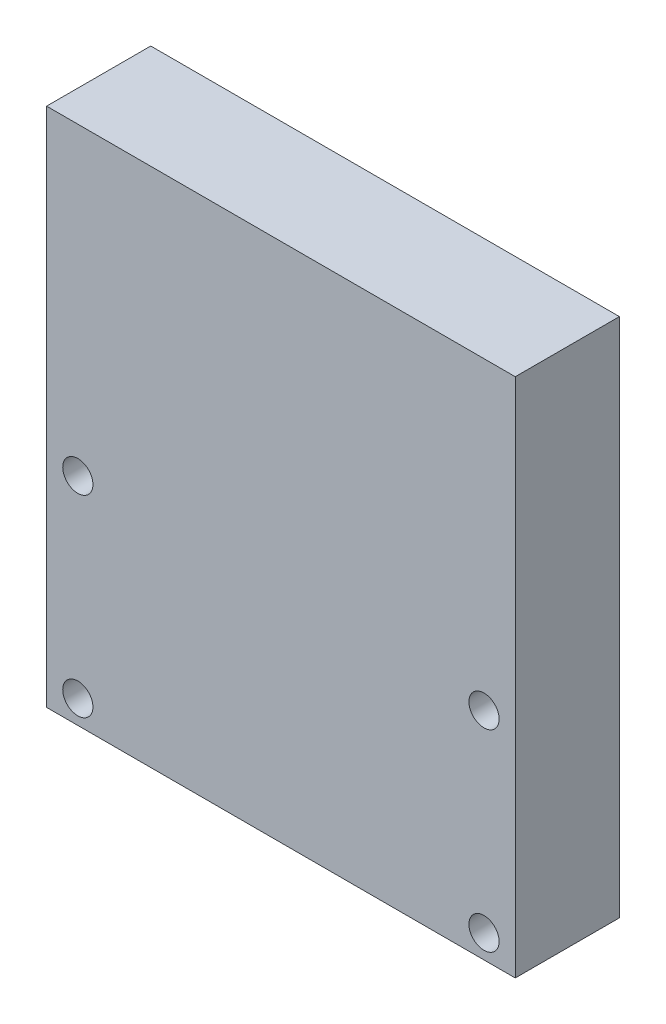
ISO-10303-21;
HEADER;
FILE_DESCRIPTION(('STEP AP214'),'2;1');
FILE_NAME('part.step','',(''),(''),'','','');
FILE_SCHEMA(('AUTOMOTIVE_DESIGN { 1 0 10303 214 1 1 1 1 }'));
ENDSEC;
DATA;
#1=APPLICATION_CONTEXT('core data for automotive mechanical design processes');
#2=APPLICATION_PROTOCOL_DEFINITION('international standard','automotive_design',2000,#1);
#3=PRODUCT_CONTEXT('',#1,'mechanical');
#4=PRODUCT('Part','Part','',(#3));
#5=PRODUCT_RELATED_PRODUCT_CATEGORY('part','',(#4));
#6=PRODUCT_DEFINITION_FORMATION('','',#4);
#7=PRODUCT_DEFINITION_CONTEXT('part definition',#1,'design');
#8=PRODUCT_DEFINITION('design','',#6,#7);
#9=PRODUCT_DEFINITION_SHAPE('','',#8);
#10=(LENGTH_UNIT() NAMED_UNIT(*) SI_UNIT(.MILLI.,.METRE.));
#11=(NAMED_UNIT(*) PLANE_ANGLE_UNIT() SI_UNIT($,.RADIAN.));
#12=(NAMED_UNIT(*) SI_UNIT($,.STERADIAN.) SOLID_ANGLE_UNIT());
#13=UNCERTAINTY_MEASURE_WITH_UNIT(LENGTH_MEASURE(1.E-05),#10,'distance_accuracy_value','');
#14=(GEOMETRIC_REPRESENTATION_CONTEXT(3) GLOBAL_UNCERTAINTY_ASSIGNED_CONTEXT((#13)) GLOBAL_UNIT_ASSIGNED_CONTEXT((#10,
#11,#12)) REPRESENTATION_CONTEXT('',''));
#15=CARTESIAN_POINT('',(0.,0.,0.));
#16=DIRECTION('',(0.,0.,1.));
#17=DIRECTION('',(1.,0.,0.));
#18=AXIS2_PLACEMENT_3D('',#15,#16,#17);
#19=CARTESIAN_POINT('',(-22.5,40.,-4.99999999999999));
#20=DIRECTION('',(1.,0.,0.));
#21=DIRECTION('',(0.,0.,-1.));
#22=AXIS2_PLACEMENT_3D('',#19,#20,#21);
#23=PLANE('',#22);
#24=DIRECTION('',(0.,0.,1.));
#25=VECTOR('',#24,1.);
#26=CARTESIAN_POINT('',(-22.5,0.,-4.99999999999999));
#27=LINE('',#26,#25);
#28=CARTESIAN_POINT('',(-22.5,0.,-4.99999999999999));
#29=VERTEX_POINT('',#28);
#30=CARTESIAN_POINT('',(-22.5,0.,5.00000000000001));
#31=VERTEX_POINT('',#30);
#32=EDGE_CURVE('E87',#29,#31,#27,.T.);
#33=ORIENTED_EDGE('',*,*,#32,.T.);
#34=DIRECTION('',(0.,-1.,0.));
#35=VECTOR('',#34,1.);
#36=CARTESIAN_POINT('',(-22.5,40.,5.00000000000001));
#37=LINE('',#36,#35);
#38=CARTESIAN_POINT('',(-22.5,50.,5.));
#39=VERTEX_POINT('',#38);
#40=EDGE_CURVE('E11',#39,#31,#37,.T.);
#41=ORIENTED_EDGE('',*,*,#40,.F.);
#42=DIRECTION('',(0.,0.,1.));
#43=VECTOR('',#42,1.);
#44=CARTESIAN_POINT('',(-22.5,50.,-4.99999999999999));
#45=LINE('',#44,#43);
#46=CARTESIAN_POINT('',(-22.5,50.,-4.99999999999999));
#47=VERTEX_POINT('',#46);
#48=EDGE_CURVE('E85',#47,#39,#45,.T.);
#49=ORIENTED_EDGE('',*,*,#48,.F.);
#50=DIRECTION('',(0.,-1.,0.));
#51=VECTOR('',#50,1.);
#52=CARTESIAN_POINT('',(-22.5,40.,-4.99999999999999));
#53=LINE('',#52,#51);
#54=EDGE_CURVE('E134',#47,#29,#53,.T.);
#55=ORIENTED_EDGE('',*,*,#54,.T.);
#56=EDGE_LOOP('',(#33,#41,#49,#55));
#57=FACE_BOUND('',#56,.T.);
#58=ADVANCED_FACE('F42',(#57),#23,.F.);
#59=CARTESIAN_POINT('',(22.5,40.,5.));
#60=DIRECTION('',(0.,0.,-1.));
#61=DIRECTION('',(-1.,0.,0.));
#62=AXIS2_PLACEMENT_3D('',#59,#60,#61);
#63=PLANE('',#62);
#64=CARTESIAN_POINT('',(-19.5,20.75,5.));
#65=DIRECTION('',(0.,0.,-1.));
#66=DIRECTION('',(-1.,0.,0.));
#67=AXIS2_PLACEMENT_3D('',#64,#65,#66);
#68=CIRCLE('',#67,1.45);
#69=CARTESIAN_POINT('',(-20.95,20.75,5.));
#70=VERTEX_POINT('',#69);
#71=EDGE_CURVE('E126',#70,#70,#68,.T.);
#72=ORIENTED_EDGE('',*,*,#71,.T.);
#73=EDGE_LOOP('',(#72));
#74=FACE_BOUND('',#73,.T.);
#75=CARTESIAN_POINT('',(19.5,20.75,5.));
#76=DIRECTION('',(0.,0.,-1.));
#77=DIRECTION('',(-1.,0.,0.));
#78=AXIS2_PLACEMENT_3D('',#75,#76,#77);
#79=CIRCLE('',#78,1.45);
#80=CARTESIAN_POINT('',(18.05,20.75,5.));
#81=VERTEX_POINT('',#80);
#82=EDGE_CURVE('E123',#81,#81,#79,.T.);
#83=ORIENTED_EDGE('',*,*,#82,.T.);
#84=EDGE_LOOP('',(#83));
#85=FACE_BOUND('',#84,.T.);
#86=CARTESIAN_POINT('',(19.5,2.25,5.));
#87=DIRECTION('',(0.,0.,-1.));
#88=DIRECTION('',(-1.,0.,0.));
#89=AXIS2_PLACEMENT_3D('',#86,#87,#88);
#90=CIRCLE('',#89,1.45);
#91=CARTESIAN_POINT('',(18.05,2.25,5.));
#92=VERTEX_POINT('',#91);
#93=EDGE_CURVE('E120',#92,#92,#90,.T.);
#94=ORIENTED_EDGE('',*,*,#93,.T.);
#95=EDGE_LOOP('',(#94));
#96=FACE_BOUND('',#95,.T.);
#97=CARTESIAN_POINT('',(-19.5,2.25,5.));
#98=DIRECTION('',(0.,0.,-1.));
#99=DIRECTION('',(-1.,0.,0.));
#100=AXIS2_PLACEMENT_3D('',#97,#98,#99);
#101=CIRCLE('',#100,1.45);
#102=CARTESIAN_POINT('',(-20.95,2.25,5.));
#103=VERTEX_POINT('',#102);
#104=EDGE_CURVE('E117',#103,#103,#101,.T.);
#105=ORIENTED_EDGE('',*,*,#104,.T.);
#106=EDGE_LOOP('',(#105));
#107=FACE_BOUND('',#106,.T.);
#108=DIRECTION('',(1.,0.,0.));
#109=VECTOR('',#108,1.);
#110=CARTESIAN_POINT('',(22.5,0.,5.));
#111=LINE('',#110,#109);
#112=CARTESIAN_POINT('',(22.5,0.,5.));
#113=VERTEX_POINT('',#112);
#114=EDGE_CURVE('E130',#31,#113,#111,.T.);
#115=ORIENTED_EDGE('',*,*,#114,.T.);
#116=DIRECTION('',(0.,-1.,0.));
#117=VECTOR('',#116,1.);
#118=CARTESIAN_POINT('',(22.5,40.,5.));
#119=LINE('',#118,#117);
#120=CARTESIAN_POINT('',(22.5,50.,5.));
#121=VERTEX_POINT('',#120);
#122=EDGE_CURVE('E49',#121,#113,#119,.T.);
#123=ORIENTED_EDGE('',*,*,#122,.F.);
#124=DIRECTION('',(1.,0.,0.));
#125=VECTOR('',#124,1.);
#126=CARTESIAN_POINT('',(-22.5,50.,5.));
#127=LINE('',#126,#125);
#128=EDGE_CURVE('E90',#39,#121,#127,.T.);
#129=ORIENTED_EDGE('',*,*,#128,.F.);
#130=ORIENTED_EDGE('',*,*,#40,.T.);
#131=EDGE_LOOP('',(#115,#123,#129,#130));
#132=FACE_BOUND('',#131,.T.);
#133=ADVANCED_FACE('F91',(#74,#85,#96,#107,#132),#63,.F.);
#134=CARTESIAN_POINT('',(22.5,40.,-5.));
#135=DIRECTION('',(-1.,0.,0.));
#136=DIRECTION('',(0.,0.,1.));
#137=AXIS2_PLACEMENT_3D('',#134,#135,#136);
#138=PLANE('',#137);
#139=DIRECTION('',(0.,0.,-1.));
#140=VECTOR('',#139,1.);
#141=CARTESIAN_POINT('',(22.5,0.,-5.));
#142=LINE('',#141,#140);
#143=CARTESIAN_POINT('',(22.5,0.,-5.));
#144=VERTEX_POINT('',#143);
#145=EDGE_CURVE('E64',#113,#144,#142,.T.);
#146=ORIENTED_EDGE('',*,*,#145,.T.);
#147=DIRECTION('',(0.,-1.,0.));
#148=VECTOR('',#147,1.);
#149=CARTESIAN_POINT('',(22.5,40.,-5.));
#150=LINE('',#149,#148);
#151=CARTESIAN_POINT('',(22.5,50.,-4.99999999999999));
#152=VERTEX_POINT('',#151);
#153=EDGE_CURVE('E136',#152,#144,#150,.T.);
#154=ORIENTED_EDGE('',*,*,#153,.F.);
#155=DIRECTION('',(0.,0.,-1.));
#156=VECTOR('',#155,1.);
#157=CARTESIAN_POINT('',(22.5,50.,-4.99999999999999));
#158=LINE('',#157,#156);
#159=EDGE_CURVE('E95',#121,#152,#158,.T.);
#160=ORIENTED_EDGE('',*,*,#159,.F.);
#161=ORIENTED_EDGE('',*,*,#122,.T.);
#162=EDGE_LOOP('',(#146,#154,#160,#161));
#163=FACE_BOUND('',#162,.T.);
#164=ADVANCED_FACE('F137',(#163),#138,.F.);
#165=CARTESIAN_POINT('',(22.5,40.,-5.));
#166=DIRECTION('',(0.,0.,1.));
#167=DIRECTION('',(1.,0.,0.));
#168=AXIS2_PLACEMENT_3D('',#165,#166,#167);
#169=PLANE('',#168);
#170=CARTESIAN_POINT('',(-19.5,20.75,-4.99999999999999));
#171=DIRECTION('',(0.,0.,-1.));
#172=DIRECTION('',(1.,0.,0.));
#173=AXIS2_PLACEMENT_3D('',#170,#171,#172);
#174=CIRCLE('',#173,1.45);
#175=CARTESIAN_POINT('',(-18.05,20.75,-4.99999999999999));
#176=VERTEX_POINT('',#175);
#177=EDGE_CURVE('E105',#176,#176,#174,.T.);
#178=ORIENTED_EDGE('',*,*,#177,.F.);
#179=EDGE_LOOP('',(#178));
#180=FACE_BOUND('',#179,.T.);
#181=CARTESIAN_POINT('',(19.5,20.75,-5.));
#182=DIRECTION('',(0.,0.,-1.));
#183=DIRECTION('',(1.,0.,0.));
#184=AXIS2_PLACEMENT_3D('',#181,#182,#183);
#185=CIRCLE('',#184,1.45);
#186=CARTESIAN_POINT('',(20.95,20.75,-5.));
#187=VERTEX_POINT('',#186);
#188=EDGE_CURVE('E110',#187,#187,#185,.T.);
#189=ORIENTED_EDGE('',*,*,#188,.F.);
#190=EDGE_LOOP('',(#189));
#191=FACE_BOUND('',#190,.T.);
#192=CARTESIAN_POINT('',(19.5,2.25,-5.));
#193=DIRECTION('',(0.,0.,-1.));
#194=DIRECTION('',(-1.,0.,0.));
#195=AXIS2_PLACEMENT_3D('',#192,#193,#194);
#196=CIRCLE('',#195,1.45);
#197=CARTESIAN_POINT('',(18.05,2.25,-5.));
#198=VERTEX_POINT('',#197);
#199=EDGE_CURVE('E106',#198,#198,#196,.T.);
#200=ORIENTED_EDGE('',*,*,#199,.F.);
#201=EDGE_LOOP('',(#200));
#202=FACE_BOUND('',#201,.T.);
#203=CARTESIAN_POINT('',(-19.5,2.25,-4.99999999999999));
#204=DIRECTION('',(0.,0.,-1.));
#205=DIRECTION('',(-1.,0.,0.));
#206=AXIS2_PLACEMENT_3D('',#203,#204,#205);
#207=CIRCLE('',#206,1.45);
#208=CARTESIAN_POINT('',(-20.95,2.25,-4.99999999999999));
#209=VERTEX_POINT('',#208);
#210=EDGE_CURVE('E109',#209,#209,#207,.T.);
#211=ORIENTED_EDGE('',*,*,#210,.F.);
#212=EDGE_LOOP('',(#211));
#213=FACE_BOUND('',#212,.T.);
#214=DIRECTION('',(-1.,0.,0.));
#215=VECTOR('',#214,1.);
#216=CARTESIAN_POINT('',(22.5,0.,-5.));
#217=LINE('',#216,#215);
#218=EDGE_CURVE('E56',#144,#29,#217,.T.);
#219=ORIENTED_EDGE('',*,*,#218,.T.);
#220=ORIENTED_EDGE('',*,*,#54,.F.);
#221=DIRECTION('',(-1.,0.,0.));
#222=VECTOR('',#221,1.);
#223=CARTESIAN_POINT('',(-22.5,50.,-4.99999999999999));
#224=LINE('',#223,#222);
#225=EDGE_CURVE('E100',#152,#47,#224,.T.);
#226=ORIENTED_EDGE('',*,*,#225,.F.);
#227=ORIENTED_EDGE('',*,*,#153,.T.);
#228=EDGE_LOOP('',(#219,#220,#226,#227));
#229=FACE_BOUND('',#228,.T.);
#230=ADVANCED_FACE('F142',(#180,#191,#202,#213,#229),#169,.F.);
#231=CARTESIAN_POINT('',(0.,0.,0.));
#232=DIRECTION('',(0.,-1.,0.));
#233=DIRECTION('',(0.,0.,-1.));
#234=AXIS2_PLACEMENT_3D('',#231,#232,#233);
#235=PLANE('',#234);
#236=ORIENTED_EDGE('',*,*,#32,.F.);
#237=ORIENTED_EDGE('',*,*,#218,.F.);
#238=ORIENTED_EDGE('',*,*,#145,.F.);
#239=ORIENTED_EDGE('',*,*,#114,.F.);
#240=EDGE_LOOP('',(#236,#237,#238,#239));
#241=FACE_BOUND('',#240,.T.);
#242=ADVANCED_FACE('F139',(#241),#235,.T.);
#243=CARTESIAN_POINT('',(-19.5,2.25,35.));
#244=DIRECTION('',(0.,0.,-1.));
#245=DIRECTION('',(-1.,0.,0.));
#246=AXIS2_PLACEMENT_3D('',#243,#244,#245);
#247=CYLINDRICAL_SURFACE('',#246,1.45);
#248=ORIENTED_EDGE('',*,*,#210,.T.);
#249=EDGE_LOOP('',(#248));
#250=FACE_BOUND('',#249,.T.);
#251=ORIENTED_EDGE('',*,*,#104,.F.);
#252=EDGE_LOOP('',(#251));
#253=FACE_BOUND('',#252,.T.);
#254=ADVANCED_FACE('F141',(#250,#253),#247,.F.);
#255=CARTESIAN_POINT('',(19.5,2.25,35.));
#256=DIRECTION('',(0.,0.,-1.));
#257=DIRECTION('',(-1.,0.,0.));
#258=AXIS2_PLACEMENT_3D('',#255,#256,#257);
#259=CYLINDRICAL_SURFACE('',#258,1.45);
#260=ORIENTED_EDGE('',*,*,#199,.T.);
#261=EDGE_LOOP('',(#260));
#262=FACE_BOUND('',#261,.T.);
#263=ORIENTED_EDGE('',*,*,#93,.F.);
#264=EDGE_LOOP('',(#263));
#265=FACE_BOUND('',#264,.T.);
#266=ADVANCED_FACE('F147',(#262,#265),#259,.F.);
#267=CARTESIAN_POINT('',(19.5,20.75,35.));
#268=DIRECTION('',(0.,0.,-1.));
#269=DIRECTION('',(-1.,0.,0.));
#270=AXIS2_PLACEMENT_3D('',#267,#268,#269);
#271=CYLINDRICAL_SURFACE('',#270,1.45);
#272=ORIENTED_EDGE('',*,*,#188,.T.);
#273=EDGE_LOOP('',(#272));
#274=FACE_BOUND('',#273,.T.);
#275=ORIENTED_EDGE('',*,*,#82,.F.);
#276=EDGE_LOOP('',(#275));
#277=FACE_BOUND('',#276,.T.);
#278=ADVANCED_FACE('F173',(#274,#277),#271,.F.);
#279=CARTESIAN_POINT('',(-19.5,20.75,35.));
#280=DIRECTION('',(0.,0.,-1.));
#281=DIRECTION('',(-1.,0.,0.));
#282=AXIS2_PLACEMENT_3D('',#279,#280,#281);
#283=CYLINDRICAL_SURFACE('',#282,1.45);
#284=ORIENTED_EDGE('',*,*,#177,.T.);
#285=EDGE_LOOP('',(#284));
#286=FACE_BOUND('',#285,.T.);
#287=ORIENTED_EDGE('',*,*,#71,.F.);
#288=EDGE_LOOP('',(#287));
#289=FACE_BOUND('',#288,.T.);
#290=ADVANCED_FACE('F179',(#286,#289),#283,.F.);
#291=CARTESIAN_POINT('',(0.,50.,0.));
#292=DIRECTION('',(0.,1.,0.));
#293=DIRECTION('',(0.,0.,1.));
#294=AXIS2_PLACEMENT_3D('',#291,#292,#293);
#295=PLANE('',#294);
#296=ORIENTED_EDGE('',*,*,#48,.T.);
#297=ORIENTED_EDGE('',*,*,#128,.T.);
#298=ORIENTED_EDGE('',*,*,#159,.T.);
#299=ORIENTED_EDGE('',*,*,#225,.T.);
#300=EDGE_LOOP('',(#296,#297,#298,#299));
#301=FACE_BOUND('',#300,.T.);
#302=ADVANCED_FACE('F98',(#301),#295,.T.);
#303=CLOSED_SHELL('',(#58,#133,#164,#230,#242,#254,#266,#278,#290,#302));
#304=MANIFOLD_SOLID_BREP('B2',#303);
#305=ADVANCED_BREP_SHAPE_REPRESENTATION('',(#18,#304),#14);
#306=SHAPE_DEFINITION_REPRESENTATION(#9,#305);
ENDSEC;
END-ISO-10303-21;
